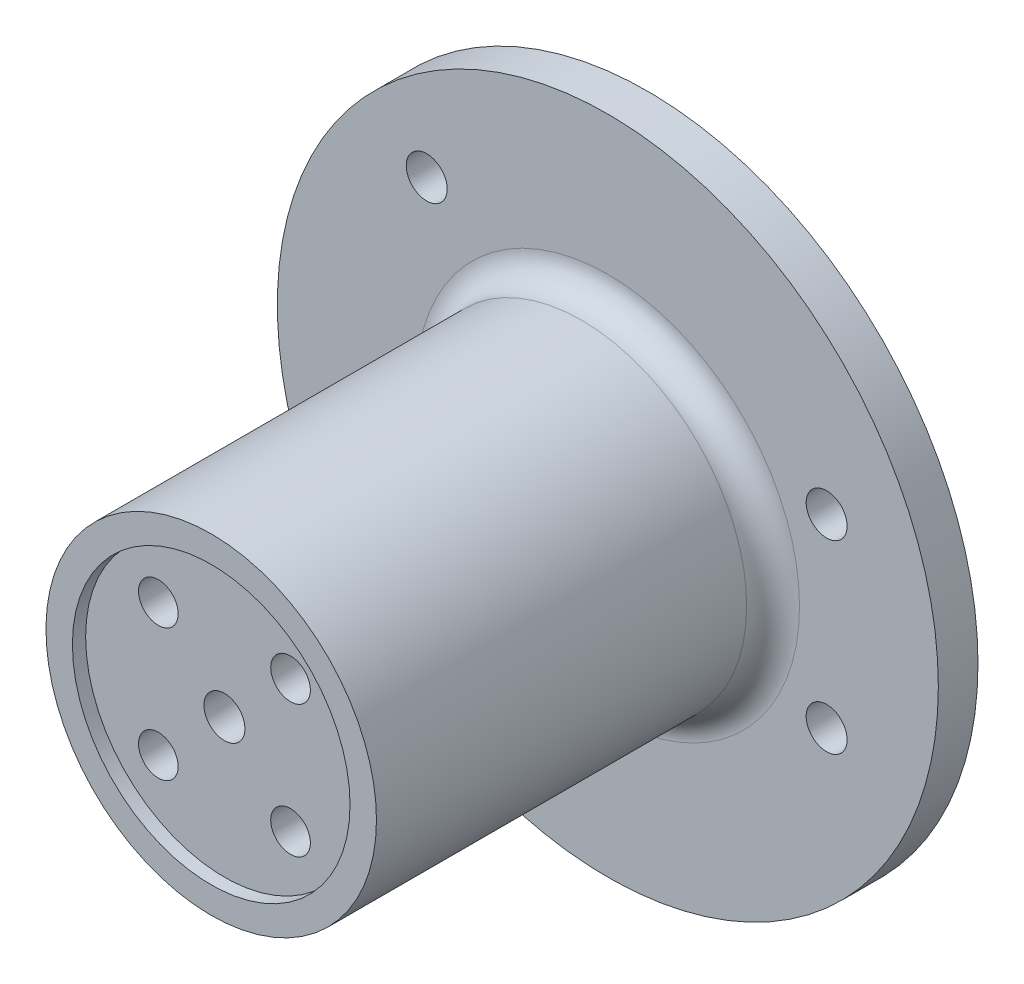
ISO-10303-21;
HEADER;
FILE_DESCRIPTION(('STEP AP214'),'2;1');
FILE_NAME('part.step','',(''),(''),'','','');
FILE_SCHEMA(('AUTOMOTIVE_DESIGN { 1 0 10303 214 1 1 1 1 }'));
ENDSEC;
DATA;
#1=APPLICATION_CONTEXT('core data for automotive mechanical design processes');
#2=APPLICATION_PROTOCOL_DEFINITION('international standard','automotive_design',2000,#1);
#3=PRODUCT_CONTEXT('',#1,'mechanical');
#4=PRODUCT('Part','Part','',(#3));
#5=PRODUCT_RELATED_PRODUCT_CATEGORY('part','',(#4));
#6=PRODUCT_DEFINITION_FORMATION('','',#4);
#7=PRODUCT_DEFINITION_CONTEXT('part definition',#1,'design');
#8=PRODUCT_DEFINITION('design','',#6,#7);
#9=PRODUCT_DEFINITION_SHAPE('','',#8);
#10=(LENGTH_UNIT() NAMED_UNIT(*) SI_UNIT(.MILLI.,.METRE.));
#11=(NAMED_UNIT(*) PLANE_ANGLE_UNIT() SI_UNIT($,.RADIAN.));
#12=(NAMED_UNIT(*) SI_UNIT($,.STERADIAN.) SOLID_ANGLE_UNIT());
#13=UNCERTAINTY_MEASURE_WITH_UNIT(LENGTH_MEASURE(1.E-05),#10,'distance_accuracy_value','');
#14=(GEOMETRIC_REPRESENTATION_CONTEXT(3) GLOBAL_UNCERTAINTY_ASSIGNED_CONTEXT((#13)) GLOBAL_UNIT_ASSIGNED_CONTEXT((#10,
#11,#12)) REPRESENTATION_CONTEXT('',''));
#15=CARTESIAN_POINT('',(0.,0.,0.));
#16=DIRECTION('',(0.,0.,1.));
#17=DIRECTION('',(1.,0.,0.));
#18=AXIS2_PLACEMENT_3D('',#15,#16,#17);
#19=CARTESIAN_POINT('',(-6.05072695196851,-22.0000000000199,33.0482951538305));
#20=DIRECTION('',(0.,0.,-1.));
#21=DIRECTION('',(-1.,0.,0.));
#22=AXIS2_PLACEMENT_3D('',#19,#20,#21);
#23=CYLINDRICAL_SURFACE('',#22,1.5);
#24=CARTESIAN_POINT('',(-6.05072695196851,-22.0000000000199,32.0482951538305));
#25=DIRECTION('',(0.,0.,1.));
#26=DIRECTION('',(1.,0.,0.));
#27=AXIS2_PLACEMENT_3D('',#24,#25,#26);
#28=CIRCLE('',#27,1.5);
#29=CARTESIAN_POINT('',(-4.55072695196851,-22.0000000000199,32.0482951538305));
#30=VERTEX_POINT('',#29);
#31=EDGE_CURVE('E157',#30,#30,#28,.F.);
#32=ORIENTED_EDGE('',*,*,#31,.F.);
#33=EDGE_LOOP('',(#32));
#34=FACE_BOUND('',#33,.T.);
#35=CARTESIAN_POINT('',(-6.05072695196851,-22.0000000000199,20.0482951538305));
#36=DIRECTION('',(0.,0.,-1.));
#37=DIRECTION('',(-1.,0.,0.));
#38=AXIS2_PLACEMENT_3D('',#35,#36,#37);
#39=CIRCLE('',#38,1.5);
#40=CARTESIAN_POINT('',(-7.55072695196851,-22.0000000000199,20.0482951538305));
#41=VERTEX_POINT('',#40);
#42=EDGE_CURVE('E98',#41,#41,#39,.F.);
#43=ORIENTED_EDGE('',*,*,#42,.F.);
#44=EDGE_LOOP('',(#43));
#45=FACE_BOUND('',#44,.T.);
#46=ADVANCED_FACE('F93',(#34,#45),#23,.F.);
#47=CARTESIAN_POINT('',(3.94927304803149,-22.0000000000199,33.0482951538305));
#48=DIRECTION('',(0.,0.,-1.));
#49=DIRECTION('',(-1.,0.,0.));
#50=AXIS2_PLACEMENT_3D('',#47,#48,#49);
#51=CYLINDRICAL_SURFACE('',#50,1.5);
#52=CARTESIAN_POINT('',(3.94927304803149,-22.0000000000199,32.0482951538305));
#53=DIRECTION('',(0.,0.,1.));
#54=DIRECTION('',(1.,0.,0.));
#55=AXIS2_PLACEMENT_3D('',#52,#53,#54);
#56=CIRCLE('',#55,1.5);
#57=CARTESIAN_POINT('',(5.44927304803149,-22.0000000000199,32.0482951538305));
#58=VERTEX_POINT('',#57);
#59=EDGE_CURVE('E165',#58,#58,#56,.F.);
#60=ORIENTED_EDGE('',*,*,#59,.F.);
#61=EDGE_LOOP('',(#60));
#62=FACE_BOUND('',#61,.T.);
#63=CARTESIAN_POINT('',(3.94927304803149,-22.0000000000199,20.0482951538305));
#64=DIRECTION('',(0.,0.,-1.));
#65=DIRECTION('',(-1.,0.,0.));
#66=AXIS2_PLACEMENT_3D('',#63,#64,#65);
#67=CIRCLE('',#66,1.5);
#68=CARTESIAN_POINT('',(2.44927304803149,-22.0000000000199,20.0482951538305));
#69=VERTEX_POINT('',#68);
#70=EDGE_CURVE('E616',#69,#69,#67,.F.);
#71=ORIENTED_EDGE('',*,*,#70,.F.);
#72=EDGE_LOOP('',(#71));
#73=FACE_BOUND('',#72,.T.);
#74=ADVANCED_FACE('F263',(#62,#73),#51,.F.);
#75=CARTESIAN_POINT('',(3.94927304803149,-12.0000000000199,33.0482951538305));
#76=DIRECTION('',(0.,0.,-1.));
#77=DIRECTION('',(-1.,0.,0.));
#78=AXIS2_PLACEMENT_3D('',#75,#76,#77);
#79=CYLINDRICAL_SURFACE('',#78,1.5);
#80=CARTESIAN_POINT('',(3.94927304803149,-12.0000000000199,32.0482951538305));
#81=DIRECTION('',(0.,0.,1.));
#82=DIRECTION('',(1.,0.,0.));
#83=AXIS2_PLACEMENT_3D('',#80,#81,#82);
#84=CIRCLE('',#83,1.5);
#85=CARTESIAN_POINT('',(5.44927304803149,-12.0000000000199,32.0482951538305));
#86=VERTEX_POINT('',#85);
#87=EDGE_CURVE('E213',#86,#86,#84,.F.);
#88=ORIENTED_EDGE('',*,*,#87,.F.);
#89=EDGE_LOOP('',(#88));
#90=FACE_BOUND('',#89,.T.);
#91=CARTESIAN_POINT('',(3.94927304803149,-12.0000000000199,20.0482951538305));
#92=DIRECTION('',(0.,0.,-1.));
#93=DIRECTION('',(-1.,0.,0.));
#94=AXIS2_PLACEMENT_3D('',#91,#92,#93);
#95=CIRCLE('',#94,1.5);
#96=CARTESIAN_POINT('',(2.44927304803149,-12.0000000000199,20.0482951538305));
#97=VERTEX_POINT('',#96);
#98=EDGE_CURVE('E619',#97,#97,#95,.F.);
#99=ORIENTED_EDGE('',*,*,#98,.F.);
#100=EDGE_LOOP('',(#99));
#101=FACE_BOUND('',#100,.T.);
#102=ADVANCED_FACE('F270',(#90,#101),#79,.F.);
#103=CARTESIAN_POINT('',(-6.05072695196851,-12.0000000000199,33.0482951538305));
#104=DIRECTION('',(0.,0.,-1.));
#105=DIRECTION('',(-1.,0.,0.));
#106=AXIS2_PLACEMENT_3D('',#103,#104,#105);
#107=CYLINDRICAL_SURFACE('',#106,1.5);
#108=CARTESIAN_POINT('',(-6.05072695196851,-12.0000000000199,32.0482951538305));
#109=DIRECTION('',(0.,0.,1.));
#110=DIRECTION('',(1.,0.,0.));
#111=AXIS2_PLACEMENT_3D('',#108,#109,#110);
#112=CIRCLE('',#111,1.5);
#113=CARTESIAN_POINT('',(-4.55072695196851,-12.0000000000199,32.0482951538305));
#114=VERTEX_POINT('',#113);
#115=EDGE_CURVE('E210',#114,#114,#112,.F.);
#116=ORIENTED_EDGE('',*,*,#115,.F.);
#117=EDGE_LOOP('',(#116));
#118=FACE_BOUND('',#117,.T.);
#119=CARTESIAN_POINT('',(-6.05072695196851,-12.0000000000199,20.0482951538305));
#120=DIRECTION('',(0.,0.,-1.));
#121=DIRECTION('',(-1.,0.,0.));
#122=AXIS2_PLACEMENT_3D('',#119,#120,#121);
#123=CIRCLE('',#122,1.5);
#124=CARTESIAN_POINT('',(-7.55072695196851,-12.0000000000199,20.0482951538305));
#125=VERTEX_POINT('',#124);
#126=EDGE_CURVE('E594',#125,#125,#123,.F.);
#127=ORIENTED_EDGE('',*,*,#126,.F.);
#128=EDGE_LOOP('',(#127));
#129=FACE_BOUND('',#128,.T.);
#130=ADVANCED_FACE('F394',(#118,#129),#107,.F.);
#131=CARTESIAN_POINT('',(-1.05072695196851,-17.0000000000199,5.04829515383054));
#132=DIRECTION('',(0.,0.,1.));
#133=DIRECTION('',(1.,0.,0.));
#134=AXIS2_PLACEMENT_3D('',#131,#132,#133);
#135=TOROIDAL_SURFACE('',#134,14.500000000003,2.);
#136=CARTESIAN_POINT('',(-1.05072695196851,-17.0000000000199,5.04829515383054));
#137=DIRECTION('',(0.,0.,1.));
#138=DIRECTION('',(1.,0.,0.));
#139=AXIS2_PLACEMENT_3D('',#136,#137,#138);
#140=CIRCLE('',#139,12.500000000003);
#141=CARTESIAN_POINT('',(-13.5155336919786,-17.9373328834045,5.04829515383054));
#142=VERTEX_POINT('',#141);
#143=CARTESIAN_POINT('',(-13.4953081936721,-15.8242458936208,5.04829515383054));
#144=VERTEX_POINT('',#143);
#145=EDGE_CURVE('E218',#142,#144,#140,.T.);
#146=ORIENTED_EDGE('',*,*,#145,.F.);
#147=CARTESIAN_POINT('',(-15.4864411923481,-18.363874763401,3.04829515383054));
#148=CARTESIAN_POINT('',(-15.4543908119173,-18.3811823434639,3.04829470411231));
#149=CARTESIAN_POINT('',(-15.4217385352699,-18.3973510687485,3.04898383655033));
#150=CARTESIAN_POINT('',(-15.3554270148997,-18.427334428486,3.05191016667104));
#151=CARTESIAN_POINT('',(-15.3217674697495,-18.4411483498074,3.05414783227903));
#152=CARTESIAN_POINT('',(-15.2197776768452,-18.4788639904075,3.06342070886065));
#153=CARTESIAN_POINT('',(-15.1502697548323,-18.4991291581804,3.07301408863829));
#154=CARTESIAN_POINT('',(-15.0104022053487,-18.5296515577418,3.09992418043489));
#155=CARTESIAN_POINT('',(-14.9400409411379,-18.5398847897993,3.11725926983235));
#156=CARTESIAN_POINT('',(-14.8010607658501,-18.5507251771902,3.15985100102196));
#157=CARTESIAN_POINT('',(-14.7324407333238,-18.5513386937811,3.18510239670384));
#158=CARTESIAN_POINT('',(-14.5998541044175,-18.5441217864822,3.24272143834822));
#159=CARTESIAN_POINT('',(-14.5358380730561,-18.5364026148442,3.27499084314592));
#160=CARTESIAN_POINT('',(-14.4127967814346,-18.5141705269042,3.34606212842527));
#161=CARTESIAN_POINT('',(-14.3537765877669,-18.4996508089445,3.38487052402944));
#162=CARTESIAN_POINT('',(-14.2173293744323,-18.4580161697399,3.48607571500377));
#163=CARTESIAN_POINT('',(-14.1429285752669,-18.4281699234113,3.55143126586676));
#164=CARTESIAN_POINT('',(-14.0066363403289,-18.3622288226431,3.69138878015772));
#165=CARTESIAN_POINT('',(-13.9447695878736,-18.3261218934829,3.76600853059816));
#166=CARTESIAN_POINT('',(-13.8321053727536,-18.250861231319,3.92469869526474));
#167=CARTESIAN_POINT('',(-13.7815948060842,-18.2116565647781,4.00894681692874));
#168=CARTESIAN_POINT('',(-13.6931779107577,-18.1353531189659,4.18472120748402));
#169=CARTESIAN_POINT('',(-13.6552689274264,-18.0982538975247,4.27624593842999));
#170=CARTESIAN_POINT('',(-13.597846656926,-18.0375304713763,4.44954047561922));
#171=CARTESIAN_POINT('',(-13.5762691342131,-18.0126837792246,4.53018823959623));
#172=CARTESIAN_POINT('',(-13.5425209520653,-17.9722190286323,4.69552216438786));
#173=CARTESIAN_POINT('',(-13.5303117158463,-17.9565631873592,4.78019022284714));
#174=CARTESIAN_POINT('',(-13.5195350418031,-17.9425939670445,4.90900071860228));
#175=CARTESIAN_POINT('',(-13.5172027931186,-17.9395277752655,4.95235233428704));
#176=CARTESIAN_POINT('',(-13.5151220627616,-17.9367929286035,5.03924881117955));
#177=CARTESIAN_POINT('',(-13.5153743014057,-17.9371252209045,5.08279372288015));
#178=CARTESIAN_POINT('',(-13.5184875700155,-17.9412152168242,5.17029038600424));
#179=CARTESIAN_POINT('',(-13.521388607718,-17.9450254513903,5.21423811430759));
#180=CARTESIAN_POINT('',(-13.5297801579536,-17.9558231980266,5.30149069902024));
#181=CARTESIAN_POINT('',(-13.5352704173169,-17.9628103994556,5.34479561785553));
#182=CARTESIAN_POINT('',(-13.5420177788812,-17.9712254905085,5.3875960449595));
#183=B_SPLINE_CURVE_WITH_KNOTS('',3,(#147,#148,#149,#150,#151,#152,#153,#154,#155,#156,#157,
#158,#159,#160,#161,#162,#163,#164,#165,#166,#167,#168,#169,#170,#171,#172,#173,#174,#175,#176,
#177,#178,#179,#180,#181,#182),.UNSPECIFIED.,.F.,.F.,(4,2,2,2,2,2,2,2,2,2,2,2,2,2,2,2,2,4),(0.,
0.109219250219212,0.218471517993421,0.436415872181963,0.654880358635437,0.873200374338769,
1.08864117869186,1.30429792070087,1.6128755618173,1.92205510169805,2.23833632263749,
2.55455087287211,2.81505765554745,3.07448587803317,3.20486966144464,3.33528978482137,
3.4677129713894,3.60012321251136),.UNSPECIFIED.);
#184=CARTESIAN_POINT('',(-15.4864411923481,-18.363874763401,3.04829515383054));
#185=VERTEX_POINT('',#184);
#186=EDGE_CURVE('E104',#142,#185,#183,.F.);
#187=ORIENTED_EDGE('',*,*,#186,.T.);
#188=CARTESIAN_POINT('',(-1.05072695196851,-17.0000000000199,3.04829515383054));
#189=DIRECTION('',(0.,0.,1.));
#190=DIRECTION('',(1.,0.,0.));
#191=AXIS2_PLACEMENT_3D('',#188,#189,#190);
#192=CIRCLE('',#191,14.500000000003);
#193=CARTESIAN_POINT('',(-15.4864411923442,-15.636125236597,3.04829515383054));
#194=VERTEX_POINT('',#193);
#195=EDGE_CURVE('E223',#194,#185,#192,.F.);
#196=ORIENTED_EDGE('',*,*,#195,.F.);
#197=CARTESIAN_POINT('',(-15.4864411923442,-15.636125236597,3.04829515383054));
#198=CARTESIAN_POINT('',(-15.4543908119133,-15.6188176565342,3.04829470411231));
#199=CARTESIAN_POINT('',(-15.4217385352659,-15.6026489312497,3.04898383655033));
#200=CARTESIAN_POINT('',(-15.3554270148956,-15.5726655715123,3.05191016667104));
#201=CARTESIAN_POINT('',(-15.3217674697454,-15.5588516501911,3.05414783227903));
#202=CARTESIAN_POINT('',(-15.2197776768409,-15.5211360095913,3.06342070886065));
#203=CARTESIAN_POINT('',(-15.150269754828,-15.5008708418185,3.07301408863829));
#204=CARTESIAN_POINT('',(-15.0104022053443,-15.4703484422575,3.09992418043489));
#205=CARTESIAN_POINT('',(-14.9400409411334,-15.4601152102003,3.11725926983235));
#206=CARTESIAN_POINT('',(-14.8010607658456,-15.4492748228098,3.15985100102196));
#207=CARTESIAN_POINT('',(-14.7324407333193,-15.4486613062191,3.18510239670384));
#208=CARTESIAN_POINT('',(-14.599854104413,-15.4558782135183,3.24272143834822));
#209=CARTESIAN_POINT('',(-14.5358380730517,-15.4635973851565,3.27499084314592));
#210=CARTESIAN_POINT('',(-14.4127967814302,-15.4858294730969,3.34606212842527));
#211=CARTESIAN_POINT('',(-14.3537765877625,-15.5003491910567,3.38487052402944));
#212=CARTESIAN_POINT('',(-14.2173293744281,-15.5419838302617,3.48607571500377));
#213=CARTESIAN_POINT('',(-14.1429285752628,-15.5718300765906,3.55143126586676));
#214=CARTESIAN_POINT('',(-14.006636340325,-15.6377711773591,3.69138878015772));
#215=CARTESIAN_POINT('',(-13.9447695878698,-15.6738781065196,3.76600853059816));
#216=CARTESIAN_POINT('',(-13.83210537275,-15.7491387686838,3.92469869526474));
#217=CARTESIAN_POINT('',(-13.7815948060807,-15.7883434352248,4.00894681692874));
#218=CARTESIAN_POINT('',(-13.6931779107544,-15.8646468810373,4.18472120748402));
#219=CARTESIAN_POINT('',(-13.6552689274232,-15.9017461024786,4.27624593842999));
#220=CARTESIAN_POINT('',(-13.597846656923,-15.9624695286272,4.44954047561922));
#221=CARTESIAN_POINT('',(-13.5762691342102,-15.9873162207789,4.53018823959623));
#222=CARTESIAN_POINT('',(-13.5425209520625,-16.0277809713713,4.69552216438786));
#223=CARTESIAN_POINT('',(-13.5303117158435,-16.0434368126444,4.78019022284714));
#224=CARTESIAN_POINT('',(-13.5195350418003,-16.0574060329591,4.90900071860228));
#225=CARTESIAN_POINT('',(-13.5172027931159,-16.0604722247381,4.95235233428703));
#226=CARTESIAN_POINT('',(-13.5151220627589,-16.0632070714001,5.03924881117955));
#227=CARTESIAN_POINT('',(-13.515374301403,-16.0628747790991,5.08279372288015));
#228=CARTESIAN_POINT('',(-13.5184875700128,-16.0587847831794,5.17029038600424));
#229=CARTESIAN_POINT('',(-13.5213886077152,-16.0549745486133,5.21423811430759));
#230=CARTESIAN_POINT('',(-13.5297801579509,-16.044176801977,5.30149069902025));
#231=CARTESIAN_POINT('',(-13.5352704173141,-16.037189600548,5.34479561785553));
#232=CARTESIAN_POINT('',(-13.5420177788784,-16.0287745094951,5.3875960449595));
#233=B_SPLINE_CURVE_WITH_KNOTS('',3,(#197,#198,#199,#200,#201,#202,#203,#204,#205,#206,#207,
#208,#209,#210,#211,#212,#213,#214,#215,#216,#217,#218,#219,#220,#221,#222,#223,#224,#225,#226,
#227,#228,#229,#230,#231,#232),.UNSPECIFIED.,.F.,.F.,(4,2,2,2,2,2,2,2,2,2,2,2,2,2,2,2,2,4),(0.,
0.109219250219211,0.21847151799342,0.436415872181964,0.654880358635438,0.873200374338768,
1.08864117869186,1.30429792070088,1.6128755618173,1.92205510169805,2.23833632263749,
2.55455087287211,2.81505765554745,3.07448587803317,3.20486966144464,3.33528978482137,
3.4677129713894,3.60012321251136),.UNSPECIFIED.);
#234=CARTESIAN_POINT('',(-13.5155336919759,-16.0626671165992,5.04829515383054));
#235=VERTEX_POINT('',#234);
#236=EDGE_CURVE('E12',#194,#235,#233,.T.);
#237=ORIENTED_EDGE('',*,*,#236,.T.);
#238=CARTESIAN_POINT('',(-1.05072695196851,-17.0000000000199,5.04829515383054));
#239=DIRECTION('',(0.,0.,1.));
#240=DIRECTION('',(1.,0.,0.));
#241=AXIS2_PLACEMENT_3D('',#238,#239,#240);
#242=CIRCLE('',#241,12.500000000003);
#243=EDGE_CURVE('E140',#144,#235,#242,.T.);
#244=ORIENTED_EDGE('',*,*,#243,.F.);
#245=EDGE_LOOP('',(#146,#187,#196,#237,#244));
#246=FACE_BOUND('',#245,.T.);
#247=ADVANCED_FACE('F95',(#246),#135,.F.);
#248=CARTESIAN_POINT('',(-1.05072695196851,-17.0000000000199,3.04829515383054));
#249=DIRECTION('',(0.,0.,1.));
#250=DIRECTION('',(1.,0.,0.));
#251=AXIS2_PLACEMENT_3D('',#248,#249,#250);
#252=PLANE('',#251);
#253=CARTESIAN_POINT('',(-14.7500000000197,-17.0000000000001,3.04829515383054));
#254=DIRECTION('',(0.,0.,1.));
#255=DIRECTION('',(1.,0.,0.));
#256=AXIS2_PLACEMENT_3D('',#253,#254,#255);
#257=CIRCLE('',#256,1.55);
#258=EDGE_CURVE('E151',#194,#185,#257,.T.);
#259=ORIENTED_EDGE('',*,*,#258,.F.);
#260=ORIENTED_EDGE('',*,*,#195,.T.);
#261=EDGE_LOOP('',(#259,#260));
#262=FACE_BOUND('',#261,.T.);
#263=CARTESIAN_POINT('',(15.500000000001,-23.9500000000001,3.04829515383054));
#264=DIRECTION('',(0.,0.,1.));
#265=DIRECTION('',(1.,0.,0.));
#266=AXIS2_PLACEMENT_3D('',#263,#264,#265);
#267=CIRCLE('',#266,1.55);
#268=CARTESIAN_POINT('',(17.050000000001,-23.9500000000001,3.04829515383054));
#269=VERTEX_POINT('',#268);
#270=EDGE_CURVE('E176',#269,#269,#267,.T.);
#271=ORIENTED_EDGE('',*,*,#270,.F.);
#272=EDGE_LOOP('',(#271));
#273=FACE_BOUND('',#272,.T.);
#274=CARTESIAN_POINT('',(-1.05072695196851,-17.0000000000199,3.04829515383054));
#275=DIRECTION('',(0.,0.,1.));
#276=DIRECTION('',(1.,0.,0.));
#277=AXIS2_PLACEMENT_3D('',#274,#275,#276);
#278=CIRCLE('',#277,25.);
#279=CARTESIAN_POINT('',(23.9492730480315,-17.0000000000199,3.04829515383054));
#280=VERTEX_POINT('',#279);
#281=EDGE_CURVE('E142',#280,#280,#278,.T.);
#282=ORIENTED_EDGE('',*,*,#281,.T.);
#283=EDGE_LOOP('',(#282));
#284=FACE_BOUND('',#283,.T.);
#285=CARTESIAN_POINT('',(-14.7500000000197,-3.00000000000005,3.04829515383054));
#286=DIRECTION('',(0.,0.,1.));
#287=DIRECTION('',(1.,0.,0.));
#288=AXIS2_PLACEMENT_3D('',#285,#286,#287);
#289=CIRCLE('',#288,1.55);
#290=CARTESIAN_POINT('',(-13.2000000000197,-3.00000000000005,3.04829515383054));
#291=VERTEX_POINT('',#290);
#292=EDGE_CURVE('E196',#291,#291,#289,.T.);
#293=ORIENTED_EDGE('',*,*,#292,.F.);
#294=EDGE_LOOP('',(#293));
#295=FACE_BOUND('',#294,.T.);
#296=CARTESIAN_POINT('',(-14.7500000000197,-31.0000000000001,3.04829515383054));
#297=DIRECTION('',(0.,0.,1.));
#298=DIRECTION('',(1.,0.,0.));
#299=AXIS2_PLACEMENT_3D('',#296,#297,#298);
#300=CIRCLE('',#299,1.55);
#301=CARTESIAN_POINT('',(-13.2000000000197,-31.0000000000001,3.04829515383054));
#302=VERTEX_POINT('',#301);
#303=EDGE_CURVE('E184',#302,#302,#300,.T.);
#304=ORIENTED_EDGE('',*,*,#303,.F.);
#305=EDGE_LOOP('',(#304));
#306=FACE_BOUND('',#305,.T.);
#307=CARTESIAN_POINT('',(15.500000000001,-9.95000000000006,3.04829515383054));
#308=DIRECTION('',(0.,0.,1.));
#309=DIRECTION('',(1.,0.,0.));
#310=AXIS2_PLACEMENT_3D('',#307,#308,#309);
#311=CIRCLE('',#310,1.55);
#312=CARTESIAN_POINT('',(17.050000000001,-9.95000000000006,3.04829515383054));
#313=VERTEX_POINT('',#312);
#314=EDGE_CURVE('E168',#313,#313,#311,.T.);
#315=ORIENTED_EDGE('',*,*,#314,.F.);
#316=EDGE_LOOP('',(#315));
#317=FACE_BOUND('',#316,.T.);
#318=ADVANCED_FACE('F249',(#262,#273,#284,#295,#306,#317),#252,.T.);
#319=CARTESIAN_POINT('',(-1.05072695196851,-17.0000000000199,0.0482951538305435));
#320=DIRECTION('',(0.,0.,1.));
#321=DIRECTION('',(1.,0.,0.));
#322=AXIS2_PLACEMENT_3D('',#319,#320,#321);
#323=PLANE('',#322);
#324=CARTESIAN_POINT('',(-6.05072695196851,-12.0000000000199,0.0482951538305435));
#325=DIRECTION('',(0.,0.,-1.));
#326=DIRECTION('',(-1.,0.,0.));
#327=AXIS2_PLACEMENT_3D('',#324,#325,#326);
#328=CIRCLE('',#327,3.);
#329=CARTESIAN_POINT('',(-9.05072695196851,-12.0000000000199,0.0482951538305435));
#330=VERTEX_POINT('',#329);
#331=EDGE_CURVE('E574',#330,#330,#328,.T.);
#332=ORIENTED_EDGE('',*,*,#331,.F.);
#333=EDGE_LOOP('',(#332));
#334=FACE_BOUND('',#333,.T.);
#335=CARTESIAN_POINT('',(-1.05072695196851,-17.0000000000199,0.0482951538305435));
#336=DIRECTION('',(0.,0.,-1.));
#337=DIRECTION('',(-1.,0.,0.));
#338=AXIS2_PLACEMENT_3D('',#335,#336,#337);
#339=CIRCLE('',#338,3.5);
#340=CARTESIAN_POINT('',(-4.55072695196851,-17.0000000000199,0.0482951538305435));
#341=VERTEX_POINT('',#340);
#342=EDGE_CURVE('E582',#341,#341,#339,.T.);
#343=ORIENTED_EDGE('',*,*,#342,.F.);
#344=EDGE_LOOP('',(#343));
#345=FACE_BOUND('',#344,.T.);
#346=CARTESIAN_POINT('',(-6.05072695196851,-22.0000000000199,0.0482951538305435));
#347=DIRECTION('',(0.,0.,-1.));
#348=DIRECTION('',(-1.,0.,0.));
#349=AXIS2_PLACEMENT_3D('',#346,#347,#348);
#350=CIRCLE('',#349,3.);
#351=CARTESIAN_POINT('',(-9.05072695196851,-22.0000000000199,0.0482951538305435));
#352=VERTEX_POINT('',#351);
#353=EDGE_CURVE('E558',#352,#352,#350,.T.);
#354=ORIENTED_EDGE('',*,*,#353,.F.);
#355=EDGE_LOOP('',(#354));
#356=FACE_BOUND('',#355,.T.);
#357=CARTESIAN_POINT('',(3.94927304803149,-22.0000000000199,0.0482951538305435));
#358=DIRECTION('',(0.,0.,-1.));
#359=DIRECTION('',(-1.,0.,0.));
#360=AXIS2_PLACEMENT_3D('',#357,#358,#359);
#361=CIRCLE('',#360,3.);
#362=CARTESIAN_POINT('',(0.949273048031492,-22.0000000000199,0.0482951538305435));
#363=VERTEX_POINT('',#362);
#364=EDGE_CURVE('E567',#363,#363,#361,.T.);
#365=ORIENTED_EDGE('',*,*,#364,.F.);
#366=EDGE_LOOP('',(#365));
#367=FACE_BOUND('',#366,.T.);
#368=CARTESIAN_POINT('',(3.94927304803149,-12.0000000000199,0.0482951538305435));
#369=DIRECTION('',(0.,0.,-1.));
#370=DIRECTION('',(-1.,0.,0.));
#371=AXIS2_PLACEMENT_3D('',#368,#369,#370);
#372=CIRCLE('',#371,3.);
#373=CARTESIAN_POINT('',(0.949273048031492,-12.0000000000199,0.0482951538305435));
#374=VERTEX_POINT('',#373);
#375=EDGE_CURVE('E586',#374,#374,#372,.T.);
#376=ORIENTED_EDGE('',*,*,#375,.F.);
#377=EDGE_LOOP('',(#376));
#378=FACE_BOUND('',#377,.T.);
#379=CARTESIAN_POINT('',(-1.05072695196851,-17.0000000000199,0.0482951538305435));
#380=DIRECTION('',(0.,0.,1.));
#381=DIRECTION('',(1.,0.,0.));
#382=AXIS2_PLACEMENT_3D('',#379,#380,#381);
#383=CIRCLE('',#382,25.);
#384=CARTESIAN_POINT('',(23.9492730480315,-17.0000000000199,0.0482951538305435));
#385=VERTEX_POINT('',#384);
#386=EDGE_CURVE('E200',#385,#385,#383,.T.);
#387=ORIENTED_EDGE('',*,*,#386,.F.);
#388=EDGE_LOOP('',(#387));
#389=FACE_BOUND('',#388,.T.);
#390=CARTESIAN_POINT('',(-14.7500000000197,-3.00000000000005,0.0482951538305435));
#391=DIRECTION('',(0.,0.,1.));
#392=DIRECTION('',(1.,0.,0.));
#393=AXIS2_PLACEMENT_3D('',#390,#391,#392);
#394=CIRCLE('',#393,1.55);
#395=CARTESIAN_POINT('',(-13.2000000000197,-3.00000000000005,0.0482951538305435));
#396=VERTEX_POINT('',#395);
#397=EDGE_CURVE('E192',#396,#396,#394,.T.);
#398=ORIENTED_EDGE('',*,*,#397,.T.);
#399=EDGE_LOOP('',(#398));
#400=FACE_BOUND('',#399,.T.);
#401=CARTESIAN_POINT('',(-14.7500000000197,-17.0000000000001,0.0482951538305435));
#402=DIRECTION('',(0.,0.,1.));
#403=DIRECTION('',(1.,0.,0.));
#404=AXIS2_PLACEMENT_3D('',#401,#402,#403);
#405=CIRCLE('',#404,1.55);
#406=CARTESIAN_POINT('',(-13.2000000000197,-17.0000000000001,0.0482951538305435));
#407=VERTEX_POINT('',#406);
#408=EDGE_CURVE('E152',#407,#407,#405,.T.);
#409=ORIENTED_EDGE('',*,*,#408,.T.);
#410=EDGE_LOOP('',(#409));
#411=FACE_BOUND('',#410,.T.);
#412=CARTESIAN_POINT('',(-14.7500000000197,-31.0000000000001,0.0482951538305435));
#413=DIRECTION('',(0.,0.,1.));
#414=DIRECTION('',(1.,0.,0.));
#415=AXIS2_PLACEMENT_3D('',#412,#413,#414);
#416=CIRCLE('',#415,1.55);
#417=CARTESIAN_POINT('',(-13.2000000000197,-31.0000000000001,0.0482951538305435));
#418=VERTEX_POINT('',#417);
#419=EDGE_CURVE('E180',#418,#418,#416,.T.);
#420=ORIENTED_EDGE('',*,*,#419,.T.);
#421=EDGE_LOOP('',(#420));
#422=FACE_BOUND('',#421,.T.);
#423=CARTESIAN_POINT('',(15.500000000001,-23.9500000000001,0.0482951538305435));
#424=DIRECTION('',(0.,0.,1.));
#425=DIRECTION('',(1.,0.,0.));
#426=AXIS2_PLACEMENT_3D('',#423,#424,#425);
#427=CIRCLE('',#426,1.55);
#428=CARTESIAN_POINT('',(17.050000000001,-23.9500000000001,0.0482951538305435));
#429=VERTEX_POINT('',#428);
#430=EDGE_CURVE('E172',#429,#429,#427,.T.);
#431=ORIENTED_EDGE('',*,*,#430,.T.);
#432=EDGE_LOOP('',(#431));
#433=FACE_BOUND('',#432,.T.);
#434=CARTESIAN_POINT('',(15.500000000001,-9.95000000000006,0.0482951538305435));
#435=DIRECTION('',(0.,0.,1.));
#436=DIRECTION('',(1.,0.,0.));
#437=AXIS2_PLACEMENT_3D('',#434,#435,#436);
#438=CIRCLE('',#437,1.55);
#439=CARTESIAN_POINT('',(17.050000000001,-9.95000000000006,0.0482951538305435));
#440=VERTEX_POINT('',#439);
#441=EDGE_CURVE('E162',#440,#440,#438,.T.);
#442=ORIENTED_EDGE('',*,*,#441,.T.);
#443=EDGE_LOOP('',(#442));
#444=FACE_BOUND('',#443,.T.);
#445=ADVANCED_FACE('F252',(#334,#345,#356,#367,#378,#389,#400,#411,#422,#433,#444),#323,.F.);
#446=CARTESIAN_POINT('',(-1.05072695196851,-17.0000000000199,3.04829515383054));
#447=DIRECTION('',(0.,0.,-1.));
#448=DIRECTION('',(-1.,0.,0.));
#449=AXIS2_PLACEMENT_3D('',#446,#447,#448);
#450=CYLINDRICAL_SURFACE('',#449,25.);
#451=ORIENTED_EDGE('',*,*,#281,.F.);
#452=EDGE_LOOP('',(#451));
#453=FACE_BOUND('',#452,.T.);
#454=ORIENTED_EDGE('',*,*,#386,.T.);
#455=EDGE_LOOP('',(#454));
#456=FACE_BOUND('',#455,.T.);
#457=ADVANCED_FACE('F247',(#453,#456),#450,.T.);
#458=CARTESIAN_POINT('',(-14.7500000000197,-3.00000000000005,3.04829515383054));
#459=DIRECTION('',(0.,0.,-1.));
#460=DIRECTION('',(-1.,0.,0.));
#461=AXIS2_PLACEMENT_3D('',#458,#459,#460);
#462=CYLINDRICAL_SURFACE('',#461,1.55);
#463=ORIENTED_EDGE('',*,*,#292,.T.);
#464=EDGE_LOOP('',(#463));
#465=FACE_BOUND('',#464,.T.);
#466=ORIENTED_EDGE('',*,*,#397,.F.);
#467=EDGE_LOOP('',(#466));
#468=FACE_BOUND('',#467,.T.);
#469=ADVANCED_FACE('F242',(#465,#468),#462,.F.);
#470=CARTESIAN_POINT('',(-14.7500000000197,-17.0000000000001,3.04829515383054));
#471=DIRECTION('',(0.,0.,-1.));
#472=DIRECTION('',(-1.,0.,0.));
#473=AXIS2_PLACEMENT_3D('',#470,#471,#472);
#474=CYLINDRICAL_SURFACE('',#473,1.55);
#475=CARTESIAN_POINT('',(-13.5155336919786,-17.9373328834045,3.04829515383054));
#476=VERTEX_POINT('',#475);
#477=CARTESIAN_POINT('',(-13.5155336919759,-16.0626671165992,3.04829515383054));
#478=VERTEX_POINT('',#477);
#479=EDGE_CURVE('E145',#476,#478,#257,.T.);
#480=ORIENTED_EDGE('',*,*,#479,.T.);
#481=DIRECTION('',(0.,0.,-1.));
#482=VECTOR('',#481,1.);
#483=CARTESIAN_POINT('',(-13.5155336919759,-16.0626671165992,3.04829515383054));
#484=LINE('',#483,#482);
#485=EDGE_CURVE('E133',#235,#478,#484,.T.);
#486=ORIENTED_EDGE('',*,*,#485,.F.);
#487=ORIENTED_EDGE('',*,*,#236,.F.);
#488=ORIENTED_EDGE('',*,*,#258,.T.);
#489=ORIENTED_EDGE('',*,*,#186,.F.);
#490=DIRECTION('',(0.,0.,1.));
#491=VECTOR('',#490,1.);
#492=CARTESIAN_POINT('',(-13.5155336919786,-17.9373328834045,3.04829515383054));
#493=LINE('',#492,#491);
#494=EDGE_CURVE('E148',#476,#142,#493,.T.);
#495=ORIENTED_EDGE('',*,*,#494,.F.);
#496=EDGE_LOOP('',(#480,#486,#487,#488,#489,#495));
#497=FACE_BOUND('',#496,.T.);
#498=ORIENTED_EDGE('',*,*,#408,.F.);
#499=EDGE_LOOP('',(#498));
#500=FACE_BOUND('',#499,.T.);
#501=ADVANCED_FACE('F146',(#497,#500),#474,.F.);
#502=CARTESIAN_POINT('',(-14.7500000000197,-31.0000000000001,3.04829515383054));
#503=DIRECTION('',(0.,0.,-1.));
#504=DIRECTION('',(-1.,0.,0.));
#505=AXIS2_PLACEMENT_3D('',#502,#503,#504);
#506=CYLINDRICAL_SURFACE('',#505,1.55);
#507=ORIENTED_EDGE('',*,*,#303,.T.);
#508=EDGE_LOOP('',(#507));
#509=FACE_BOUND('',#508,.T.);
#510=ORIENTED_EDGE('',*,*,#419,.F.);
#511=EDGE_LOOP('',(#510));
#512=FACE_BOUND('',#511,.T.);
#513=ADVANCED_FACE('F241',(#509,#512),#506,.F.);
#514=CARTESIAN_POINT('',(15.500000000001,-23.9500000000001,3.04829515383054));
#515=DIRECTION('',(0.,0.,-1.));
#516=DIRECTION('',(-1.,0.,0.));
#517=AXIS2_PLACEMENT_3D('',#514,#515,#516);
#518=CYLINDRICAL_SURFACE('',#517,1.55);
#519=ORIENTED_EDGE('',*,*,#270,.T.);
#520=EDGE_LOOP('',(#519));
#521=FACE_BOUND('',#520,.T.);
#522=ORIENTED_EDGE('',*,*,#430,.F.);
#523=EDGE_LOOP('',(#522));
#524=FACE_BOUND('',#523,.T.);
#525=ADVANCED_FACE('F288',(#521,#524),#518,.F.);
#526=CARTESIAN_POINT('',(15.500000000001,-9.95000000000006,3.04829515383054));
#527=DIRECTION('',(0.,0.,-1.));
#528=DIRECTION('',(-1.,0.,0.));
#529=AXIS2_PLACEMENT_3D('',#526,#527,#528);
#530=CYLINDRICAL_SURFACE('',#529,1.55);
#531=ORIENTED_EDGE('',*,*,#314,.T.);
#532=EDGE_LOOP('',(#531));
#533=FACE_BOUND('',#532,.T.);
#534=ORIENTED_EDGE('',*,*,#441,.F.);
#535=EDGE_LOOP('',(#534));
#536=FACE_BOUND('',#535,.T.);
#537=ADVANCED_FACE('F285',(#533,#536),#530,.F.);
#538=CARTESIAN_POINT('',(-1.05072695196851,-17.0000000000199,33.0482951538305));
#539=DIRECTION('',(0.,0.,-1.));
#540=DIRECTION('',(-1.,0.,0.));
#541=AXIS2_PLACEMENT_3D('',#538,#539,#540);
#542=CYLINDRICAL_SURFACE('',#541,12.500000000003);
#543=CARTESIAN_POINT('',(-1.05072695196851,-17.0000000000199,33.0482951538305));
#544=DIRECTION('',(0.,0.,1.));
#545=DIRECTION('',(1.,0.,0.));
#546=AXIS2_PLACEMENT_3D('',#543,#544,#545);
#547=CIRCLE('',#546,12.500000000003);
#548=CARTESIAN_POINT('',(11.4492730480345,-17.0000000000199,33.0482951538305));
#549=VERTEX_POINT('',#548);
#550=EDGE_CURVE('E156',#549,#549,#547,.T.);
#551=ORIENTED_EDGE('',*,*,#550,.F.);
#552=EDGE_LOOP('',(#551));
#553=FACE_BOUND('',#552,.T.);
#554=CARTESIAN_POINT('',(-1.05072695196851,-17.0000000000199,3.04829515383054));
#555=DIRECTION('',(0.,0.,1.));
#556=DIRECTION('',(1.,0.,0.));
#557=AXIS2_PLACEMENT_3D('',#554,#555,#556);
#558=CIRCLE('',#557,12.500000000003);
#559=EDGE_CURVE('E138',#478,#476,#558,.T.);
#560=ORIENTED_EDGE('',*,*,#559,.T.);
#561=ORIENTED_EDGE('',*,*,#494,.T.);
#562=ORIENTED_EDGE('',*,*,#145,.T.);
#563=ORIENTED_EDGE('',*,*,#243,.T.);
#564=ORIENTED_EDGE('',*,*,#485,.T.);
#565=EDGE_LOOP('',(#560,#561,#562,#563,#564));
#566=FACE_BOUND('',#565,.T.);
#567=ADVANCED_FACE('F135',(#553,#566),#542,.T.);
#568=CARTESIAN_POINT('',(-1.05072695196851,-17.0000000000199,33.0482951538305));
#569=DIRECTION('',(0.,0.,1.));
#570=DIRECTION('',(1.,0.,0.));
#571=AXIS2_PLACEMENT_3D('',#568,#569,#570);
#572=PLANE('',#571);
#573=CARTESIAN_POINT('',(-1.05072695196851,-17.0000000000199,33.0482951538305));
#574=DIRECTION('',(0.,0.,1.));
#575=DIRECTION('',(1.,0.,0.));
#576=AXIS2_PLACEMENT_3D('',#573,#574,#575);
#577=CIRCLE('',#576,10.5);
#578=CARTESIAN_POINT('',(9.4492730480315,-17.0000000000199,33.0482951538305));
#579=VERTEX_POINT('',#578);
#580=EDGE_CURVE('E601',#579,#579,#577,.T.);
#581=ORIENTED_EDGE('',*,*,#580,.F.);
#582=EDGE_LOOP('',(#581));
#583=FACE_BOUND('',#582,.T.);
#584=ORIENTED_EDGE('',*,*,#550,.T.);
#585=EDGE_LOOP('',(#584));
#586=FACE_BOUND('',#585,.T.);
#587=ADVANCED_FACE('F277',(#583,#586),#572,.T.);
#588=CARTESIAN_POINT('',(-1.05072695196851,-17.0000000000199,3.04829515383054));
#589=DIRECTION('',(0.,0.,1.));
#590=DIRECTION('',(1.,0.,0.));
#591=AXIS2_PLACEMENT_3D('',#588,#589,#590);
#592=PLANE('',#591);
#593=ORIENTED_EDGE('',*,*,#479,.F.);
#594=ORIENTED_EDGE('',*,*,#559,.F.);
#595=EDGE_LOOP('',(#593,#594));
#596=FACE_BOUND('',#595,.T.);
#597=ADVANCED_FACE('F154',(#596),#592,.F.);
#598=CARTESIAN_POINT('',(-1.05072695196851,-17.0000000000199,32.0482951538305));
#599=DIRECTION('',(0.,0.,1.));
#600=DIRECTION('',(1.,0.,0.));
#601=AXIS2_PLACEMENT_3D('',#598,#599,#600);
#602=PLANE('',#601);
#603=CARTESIAN_POINT('',(-1.05072695196851,-17.0000000000199,32.0482951538305));
#604=DIRECTION('',(0.,0.,1.));
#605=DIRECTION('',(1.,0.,0.));
#606=AXIS2_PLACEMENT_3D('',#603,#604,#605);
#607=CIRCLE('',#606,10.5);
#608=CARTESIAN_POINT('',(9.4492730480315,-17.0000000000199,32.0482951538305));
#609=VERTEX_POINT('',#608);
#610=EDGE_CURVE('E214',#609,#609,#607,.T.);
#611=ORIENTED_EDGE('',*,*,#610,.T.);
#612=EDGE_LOOP('',(#611));
#613=FACE_BOUND('',#612,.T.);
#614=ORIENTED_EDGE('',*,*,#115,.T.);
#615=EDGE_LOOP('',(#614));
#616=FACE_BOUND('',#615,.T.);
#617=ORIENTED_EDGE('',*,*,#87,.T.);
#618=EDGE_LOOP('',(#617));
#619=FACE_BOUND('',#618,.T.);
#620=ORIENTED_EDGE('',*,*,#59,.T.);
#621=EDGE_LOOP('',(#620));
#622=FACE_BOUND('',#621,.T.);
#623=ORIENTED_EDGE('',*,*,#31,.T.);
#624=EDGE_LOOP('',(#623));
#625=FACE_BOUND('',#624,.T.);
#626=CARTESIAN_POINT('',(-1.05072695196851,-17.0000000000199,32.0482951538305));
#627=DIRECTION('',(0.,0.,-1.));
#628=DIRECTION('',(-1.,0.,0.));
#629=AXIS2_PLACEMENT_3D('',#626,#627,#628);
#630=CIRCLE('',#629,1.55);
#631=CARTESIAN_POINT('',(-2.60072695196851,-17.0000000000199,32.0482951538305));
#632=VERTEX_POINT('',#631);
#633=EDGE_CURVE('E547',#632,#632,#630,.T.);
#634=ORIENTED_EDGE('',*,*,#633,.T.);
#635=EDGE_LOOP('',(#634));
#636=FACE_BOUND('',#635,.T.);
#637=ADVANCED_FACE('F283',(#613,#616,#619,#622,#625,#636),#602,.T.);
#638=CARTESIAN_POINT('',(-1.05072695196851,-17.0000000000199,32.0482951538305));
#639=DIRECTION('',(0.,0.,1.));
#640=DIRECTION('',(1.,0.,0.));
#641=AXIS2_PLACEMENT_3D('',#638,#639,#640);
#642=CYLINDRICAL_SURFACE('',#641,10.5);
#643=ORIENTED_EDGE('',*,*,#610,.F.);
#644=EDGE_LOOP('',(#643));
#645=FACE_BOUND('',#644,.T.);
#646=ORIENTED_EDGE('',*,*,#580,.T.);
#647=EDGE_LOOP('',(#646));
#648=FACE_BOUND('',#647,.T.);
#649=ADVANCED_FACE('F373',(#645,#648),#642,.F.);
#650=CARTESIAN_POINT('',(0.,0.,20.0482951538305));
#651=DIRECTION('',(0.,0.,-1.));
#652=DIRECTION('',(-1.,0.,0.));
#653=AXIS2_PLACEMENT_3D('',#650,#651,#652);
#654=PLANE('',#653);
#655=CARTESIAN_POINT('',(3.94927304803149,-12.0000000000199,20.0482951538305));
#656=DIRECTION('',(0.,0.,-1.));
#657=DIRECTION('',(-1.,0.,0.));
#658=AXIS2_PLACEMENT_3D('',#655,#656,#657);
#659=CIRCLE('',#658,3.);
#660=CARTESIAN_POINT('',(0.949273048031492,-12.0000000000199,20.0482951538305));
#661=VERTEX_POINT('',#660);
#662=EDGE_CURVE('E590',#661,#661,#659,.T.);
#663=ORIENTED_EDGE('',*,*,#662,.T.);
#664=EDGE_LOOP('',(#663));
#665=FACE_BOUND('',#664,.T.);
#666=ORIENTED_EDGE('',*,*,#98,.T.);
#667=EDGE_LOOP('',(#666));
#668=FACE_BOUND('',#667,.T.);
#669=ADVANCED_FACE('F385',(#665,#668),#654,.T.);
#670=CARTESIAN_POINT('',(3.94927304803149,-12.0000000000199,20.0482951538305));
#671=DIRECTION('',(0.,0.,-1.));
#672=DIRECTION('',(-1.,0.,0.));
#673=AXIS2_PLACEMENT_3D('',#670,#671,#672);
#674=CYLINDRICAL_SURFACE('',#673,3.);
#675=ORIENTED_EDGE('',*,*,#662,.F.);
#676=EDGE_LOOP('',(#675));
#677=FACE_BOUND('',#676,.T.);
#678=ORIENTED_EDGE('',*,*,#375,.T.);
#679=EDGE_LOOP('',(#678));
#680=FACE_BOUND('',#679,.T.);
#681=ADVANCED_FACE('F436',(#677,#680),#674,.F.);
#682=CARTESIAN_POINT('',(3.94927304803149,-22.0000000000199,20.0482951538305));
#683=DIRECTION('',(0.,0.,-1.));
#684=DIRECTION('',(-1.,0.,0.));
#685=AXIS2_PLACEMENT_3D('',#682,#683,#684);
#686=PLANE('',#685);
#687=CARTESIAN_POINT('',(3.94927304803149,-22.0000000000199,20.0482951538305));
#688=DIRECTION('',(0.,0.,-1.));
#689=DIRECTION('',(-1.,0.,0.));
#690=AXIS2_PLACEMENT_3D('',#687,#688,#689);
#691=CIRCLE('',#690,3.);
#692=CARTESIAN_POINT('',(0.949273048031492,-22.0000000000199,20.0482951538305));
#693=VERTEX_POINT('',#692);
#694=EDGE_CURVE('E555',#693,#693,#691,.T.);
#695=ORIENTED_EDGE('',*,*,#694,.T.);
#696=EDGE_LOOP('',(#695));
#697=FACE_BOUND('',#696,.T.);
#698=ORIENTED_EDGE('',*,*,#70,.T.);
#699=EDGE_LOOP('',(#698));
#700=FACE_BOUND('',#699,.T.);
#701=ADVANCED_FACE('F449',(#697,#700),#686,.T.);
#702=CARTESIAN_POINT('',(3.94927304803149,-22.0000000000199,20.0482951538305));
#703=DIRECTION('',(0.,0.,-1.));
#704=DIRECTION('',(-1.,0.,0.));
#705=AXIS2_PLACEMENT_3D('',#702,#703,#704);
#706=CYLINDRICAL_SURFACE('',#705,3.);
#707=ORIENTED_EDGE('',*,*,#694,.F.);
#708=EDGE_LOOP('',(#707));
#709=FACE_BOUND('',#708,.T.);
#710=ORIENTED_EDGE('',*,*,#364,.T.);
#711=EDGE_LOOP('',(#710));
#712=FACE_BOUND('',#711,.T.);
#713=ADVANCED_FACE('F459',(#709,#712),#706,.F.);
#714=CARTESIAN_POINT('',(-6.05072695196851,-22.0000000000199,20.0482951538305));
#715=DIRECTION('',(0.,0.,-1.));
#716=DIRECTION('',(-1.,0.,0.));
#717=AXIS2_PLACEMENT_3D('',#714,#715,#716);
#718=PLANE('',#717);
#719=CARTESIAN_POINT('',(-6.05072695196851,-22.0000000000199,20.0482951538305));
#720=DIRECTION('',(0.,0.,-1.));
#721=DIRECTION('',(-1.,0.,0.));
#722=AXIS2_PLACEMENT_3D('',#719,#720,#721);
#723=CIRCLE('',#722,3.);
#724=CARTESIAN_POINT('',(-9.05072695196851,-22.0000000000199,20.0482951538305));
#725=VERTEX_POINT('',#724);
#726=EDGE_CURVE('E563',#725,#725,#723,.T.);
#727=ORIENTED_EDGE('',*,*,#726,.T.);
#728=EDGE_LOOP('',(#727));
#729=FACE_BOUND('',#728,.T.);
#730=ORIENTED_EDGE('',*,*,#42,.T.);
#731=EDGE_LOOP('',(#730));
#732=FACE_BOUND('',#731,.T.);
#733=ADVANCED_FACE('F469',(#729,#732),#718,.T.);
#734=CARTESIAN_POINT('',(-6.05072695196851,-22.0000000000199,20.0482951538305));
#735=DIRECTION('',(0.,0.,-1.));
#736=DIRECTION('',(-1.,0.,0.));
#737=AXIS2_PLACEMENT_3D('',#734,#735,#736);
#738=CYLINDRICAL_SURFACE('',#737,3.);
#739=ORIENTED_EDGE('',*,*,#726,.F.);
#740=EDGE_LOOP('',(#739));
#741=FACE_BOUND('',#740,.T.);
#742=ORIENTED_EDGE('',*,*,#353,.T.);
#743=EDGE_LOOP('',(#742));
#744=FACE_BOUND('',#743,.T.);
#745=ADVANCED_FACE('F479',(#741,#744),#738,.F.);
#746=CARTESIAN_POINT('',(0.,0.,20.0482951538305));
#747=DIRECTION('',(0.,0.,-1.));
#748=DIRECTION('',(-1.,0.,0.));
#749=AXIS2_PLACEMENT_3D('',#746,#747,#748);
#750=PLANE('',#749);
#751=CARTESIAN_POINT('',(-1.05072695196851,-17.0000000000199,20.0482951538305));
#752=DIRECTION('',(0.,0.,-1.));
#753=DIRECTION('',(-1.,0.,0.));
#754=AXIS2_PLACEMENT_3D('',#751,#752,#753);
#755=CIRCLE('',#754,3.5);
#756=CARTESIAN_POINT('',(-4.55072695196851,-17.0000000000199,20.0482951538305));
#757=VERTEX_POINT('',#756);
#758=EDGE_CURVE('E578',#757,#757,#755,.T.);
#759=ORIENTED_EDGE('',*,*,#758,.T.);
#760=EDGE_LOOP('',(#759));
#761=FACE_BOUND('',#760,.T.);
#762=CARTESIAN_POINT('',(-1.05072695196851,-17.0000000000199,20.0482951538305));
#763=DIRECTION('',(0.,0.,-1.));
#764=DIRECTION('',(-1.,0.,0.));
#765=AXIS2_PLACEMENT_3D('',#762,#763,#764);
#766=CIRCLE('',#765,1.55);
#767=CARTESIAN_POINT('',(-2.60072695196851,-17.0000000000199,20.0482951538305));
#768=VERTEX_POINT('',#767);
#769=EDGE_CURVE('E550',#768,#768,#766,.T.);
#770=ORIENTED_EDGE('',*,*,#769,.F.);
#771=EDGE_LOOP('',(#770));
#772=FACE_BOUND('',#771,.T.);
#773=ADVANCED_FACE('F489',(#761,#772),#750,.T.);
#774=CARTESIAN_POINT('',(-1.05072695196851,-17.0000000000199,20.0482951538305));
#775=DIRECTION('',(0.,0.,-1.));
#776=DIRECTION('',(-1.,0.,0.));
#777=AXIS2_PLACEMENT_3D('',#774,#775,#776);
#778=CYLINDRICAL_SURFACE('',#777,3.5);
#779=ORIENTED_EDGE('',*,*,#758,.F.);
#780=EDGE_LOOP('',(#779));
#781=FACE_BOUND('',#780,.T.);
#782=ORIENTED_EDGE('',*,*,#342,.T.);
#783=EDGE_LOOP('',(#782));
#784=FACE_BOUND('',#783,.T.);
#785=ADVANCED_FACE('F500',(#781,#784),#778,.F.);
#786=CARTESIAN_POINT('',(-6.05072695196851,-12.0000000000199,20.0482951538305));
#787=DIRECTION('',(0.,0.,-1.));
#788=DIRECTION('',(-1.,0.,0.));
#789=AXIS2_PLACEMENT_3D('',#786,#787,#788);
#790=PLANE('',#789);
#791=CARTESIAN_POINT('',(-6.05072695196851,-12.0000000000199,20.0482951538305));
#792=DIRECTION('',(0.,0.,-1.));
#793=DIRECTION('',(-1.,0.,0.));
#794=AXIS2_PLACEMENT_3D('',#791,#792,#793);
#795=CIRCLE('',#794,3.);
#796=CARTESIAN_POINT('',(-9.05072695196851,-12.0000000000199,20.0482951538305));
#797=VERTEX_POINT('',#796);
#798=EDGE_CURVE('E562',#797,#797,#795,.T.);
#799=ORIENTED_EDGE('',*,*,#798,.T.);
#800=EDGE_LOOP('',(#799));
#801=FACE_BOUND('',#800,.T.);
#802=ORIENTED_EDGE('',*,*,#126,.T.);
#803=EDGE_LOOP('',(#802));
#804=FACE_BOUND('',#803,.T.);
#805=ADVANCED_FACE('F511',(#801,#804),#790,.T.);
#806=CARTESIAN_POINT('',(-6.05072695196851,-12.0000000000199,20.0482951538305));
#807=DIRECTION('',(0.,0.,-1.));
#808=DIRECTION('',(-1.,0.,0.));
#809=AXIS2_PLACEMENT_3D('',#806,#807,#808);
#810=CYLINDRICAL_SURFACE('',#809,3.);
#811=ORIENTED_EDGE('',*,*,#798,.F.);
#812=EDGE_LOOP('',(#811));
#813=FACE_BOUND('',#812,.T.);
#814=ORIENTED_EDGE('',*,*,#331,.T.);
#815=EDGE_LOOP('',(#814));
#816=FACE_BOUND('',#815,.T.);
#817=ADVANCED_FACE('F520',(#813,#816),#810,.F.);
#818=CARTESIAN_POINT('',(-1.05072695196851,-17.0000000000199,32.0482951538305));
#819=DIRECTION('',(0.,0.,-1.));
#820=DIRECTION('',(-1.,0.,0.));
#821=AXIS2_PLACEMENT_3D('',#818,#819,#820);
#822=CYLINDRICAL_SURFACE('',#821,1.55);
#823=ORIENTED_EDGE('',*,*,#633,.F.);
#824=EDGE_LOOP('',(#823));
#825=FACE_BOUND('',#824,.T.);
#826=ORIENTED_EDGE('',*,*,#769,.T.);
#827=EDGE_LOOP('',(#826));
#828=FACE_BOUND('',#827,.T.);
#829=ADVANCED_FACE('F529',(#825,#828),#822,.F.);
#830=CLOSED_SHELL('',(#46,#74,#102,#130,#247,#318,#445,#457,#469,#501,#513,#525,#537,#567,#587,
#597,#637,#649,#669,#681,#701,#713,#733,#745,#773,#785,#805,#817,#829));
#831=MANIFOLD_SOLID_BREP('B2',#830);
#832=ADVANCED_BREP_SHAPE_REPRESENTATION('',(#18,#831),#14);
#833=SHAPE_DEFINITION_REPRESENTATION(#9,#832);
ENDSEC;
END-ISO-10303-21;
